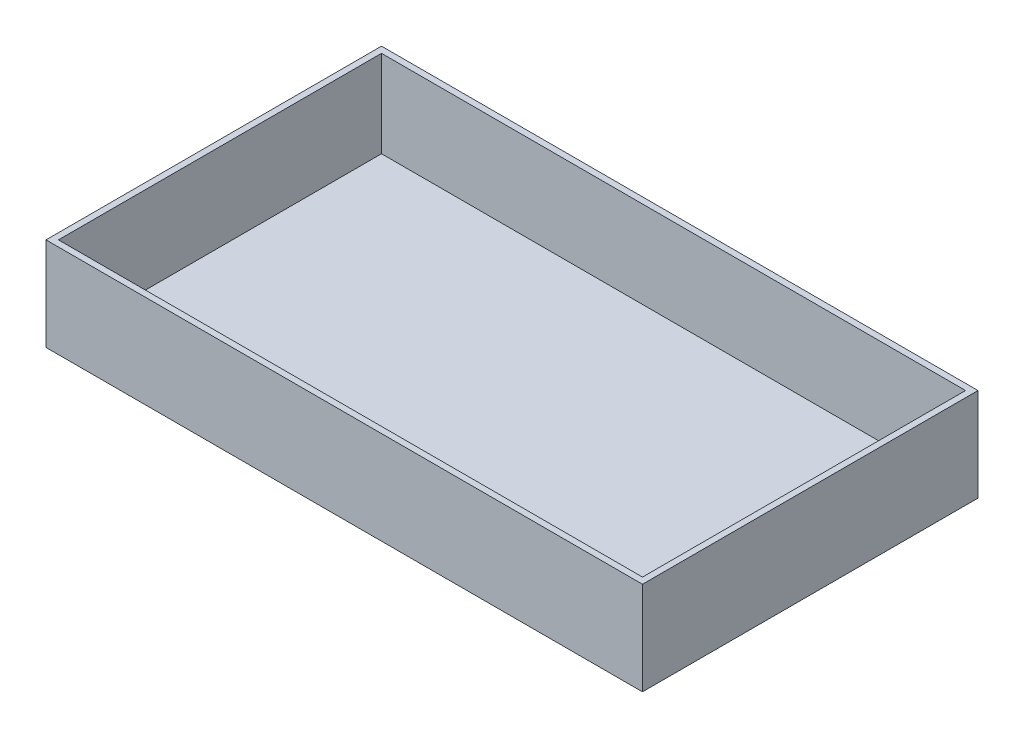
ISO-10303-21;
HEADER;
FILE_DESCRIPTION(('STEP AP214'),'2;1');
FILE_NAME('part.step','',(''),(''),'','','');
FILE_SCHEMA(('AUTOMOTIVE_DESIGN { 1 0 10303 214 1 1 1 1 }'));
ENDSEC;
DATA;
#1=APPLICATION_CONTEXT('core data for automotive mechanical design processes');
#2=APPLICATION_PROTOCOL_DEFINITION('international standard','automotive_design',2000,#1);
#3=PRODUCT_CONTEXT('',#1,'mechanical');
#4=PRODUCT('Part','Part','',(#3));
#5=PRODUCT_RELATED_PRODUCT_CATEGORY('part','',(#4));
#6=PRODUCT_DEFINITION_FORMATION('','',#4);
#7=PRODUCT_DEFINITION_CONTEXT('part definition',#1,'design');
#8=PRODUCT_DEFINITION('design','',#6,#7);
#9=PRODUCT_DEFINITION_SHAPE('','',#8);
#10=(LENGTH_UNIT() NAMED_UNIT(*) SI_UNIT(.MILLI.,.METRE.));
#11=(NAMED_UNIT(*) PLANE_ANGLE_UNIT() SI_UNIT($,.RADIAN.));
#12=(NAMED_UNIT(*) SI_UNIT($,.STERADIAN.) SOLID_ANGLE_UNIT());
#13=UNCERTAINTY_MEASURE_WITH_UNIT(LENGTH_MEASURE(1.E-05),#10,'distance_accuracy_value','');
#14=(GEOMETRIC_REPRESENTATION_CONTEXT(3) GLOBAL_UNCERTAINTY_ASSIGNED_CONTEXT((#13)) GLOBAL_UNIT_ASSIGNED_CONTEXT((#10,
#11,#12)) REPRESENTATION_CONTEXT('',''));
#15=CARTESIAN_POINT('',(0.,0.,0.));
#16=DIRECTION('',(0.,0.,1.));
#17=DIRECTION('',(1.,0.,0.));
#18=AXIS2_PLACEMENT_3D('',#15,#16,#17);
#19=CARTESIAN_POINT('',(240.,75.,-135.));
#20=DIRECTION('',(-1.,0.,0.));
#21=DIRECTION('',(0.,0.,1.));
#22=AXIS2_PLACEMENT_3D('',#19,#20,#21);
#23=PLANE('',#22);
#24=DIRECTION('',(0.,0.,-1.));
#25=VECTOR('',#24,1.);
#26=CARTESIAN_POINT('',(240.,0.,-135.));
#27=LINE('',#26,#25);
#28=CARTESIAN_POINT('',(240.,0.,135.));
#29=VERTEX_POINT('',#28);
#30=CARTESIAN_POINT('',(240.,0.,-135.));
#31=VERTEX_POINT('',#30);
#32=EDGE_CURVE('E167',#29,#31,#27,.T.);
#33=ORIENTED_EDGE('',*,*,#32,.T.);
#34=DIRECTION('',(0.,-1.,0.));
#35=VECTOR('',#34,1.);
#36=CARTESIAN_POINT('',(240.,75.,-135.));
#37=LINE('',#36,#35);
#38=CARTESIAN_POINT('',(240.,75.,-135.));
#39=VERTEX_POINT('',#38);
#40=EDGE_CURVE('E11',#39,#31,#37,.T.);
#41=ORIENTED_EDGE('',*,*,#40,.F.);
#42=DIRECTION('',(0.,0.,-1.));
#43=VECTOR('',#42,1.);
#44=CARTESIAN_POINT('',(240.,75.,-135.));
#45=LINE('',#44,#43);
#46=CARTESIAN_POINT('',(240.,75.,135.));
#47=VERTEX_POINT('',#46);
#48=EDGE_CURVE('E156',#47,#39,#45,.T.);
#49=ORIENTED_EDGE('',*,*,#48,.F.);
#50=DIRECTION('',(0.,-1.,0.));
#51=VECTOR('',#50,1.);
#52=CARTESIAN_POINT('',(240.,75.,135.));
#53=LINE('',#52,#51);
#54=EDGE_CURVE('E166',#47,#29,#53,.T.);
#55=ORIENTED_EDGE('',*,*,#54,.T.);
#56=EDGE_LOOP('',(#33,#41,#49,#55));
#57=FACE_BOUND('',#56,.T.);
#58=ADVANCED_FACE('F39',(#57),#23,.F.);
#59=CARTESIAN_POINT('',(-240.,75.,-135.));
#60=DIRECTION('',(0.,0.,1.));
#61=DIRECTION('',(1.,0.,0.));
#62=AXIS2_PLACEMENT_3D('',#59,#60,#61);
#63=PLANE('',#62);
#64=DIRECTION('',(-1.,0.,0.));
#65=VECTOR('',#64,1.);
#66=CARTESIAN_POINT('',(-240.,0.,-135.));
#67=LINE('',#66,#65);
#68=CARTESIAN_POINT('',(-240.,0.,-135.));
#69=VERTEX_POINT('',#68);
#70=EDGE_CURVE('E171',#31,#69,#67,.T.);
#71=ORIENTED_EDGE('',*,*,#70,.T.);
#72=DIRECTION('',(0.,-1.,0.));
#73=VECTOR('',#72,1.);
#74=CARTESIAN_POINT('',(-240.,75.,-135.));
#75=LINE('',#74,#73);
#76=CARTESIAN_POINT('',(-240.,75.,-135.));
#77=VERTEX_POINT('',#76);
#78=EDGE_CURVE('E47',#77,#69,#75,.T.);
#79=ORIENTED_EDGE('',*,*,#78,.F.);
#80=DIRECTION('',(-1.,0.,0.));
#81=VECTOR('',#80,1.);
#82=CARTESIAN_POINT('',(-240.,75.,-135.));
#83=LINE('',#82,#81);
#84=EDGE_CURVE('E91',#39,#77,#83,.T.);
#85=ORIENTED_EDGE('',*,*,#84,.F.);
#86=ORIENTED_EDGE('',*,*,#40,.T.);
#87=EDGE_LOOP('',(#71,#79,#85,#86));
#88=FACE_BOUND('',#87,.T.);
#89=ADVANCED_FACE('F206',(#88),#63,.F.);
#90=CARTESIAN_POINT('',(-240.,75.,-135.));
#91=DIRECTION('',(1.,0.,0.));
#92=DIRECTION('',(0.,0.,-1.));
#93=AXIS2_PLACEMENT_3D('',#90,#91,#92);
#94=PLANE('',#93);
#95=DIRECTION('',(0.,0.,1.));
#96=VECTOR('',#95,1.);
#97=CARTESIAN_POINT('',(-240.,0.,-135.));
#98=LINE('',#97,#96);
#99=CARTESIAN_POINT('',(-240.,0.,135.));
#100=VERTEX_POINT('',#99);
#101=EDGE_CURVE('E174',#69,#100,#98,.T.);
#102=ORIENTED_EDGE('',*,*,#101,.T.);
#103=DIRECTION('',(0.,-1.,0.));
#104=VECTOR('',#103,1.);
#105=CARTESIAN_POINT('',(-240.,75.,135.));
#106=LINE('',#105,#104);
#107=CARTESIAN_POINT('',(-240.,75.,135.));
#108=VERTEX_POINT('',#107);
#109=EDGE_CURVE('E181',#108,#100,#106,.T.);
#110=ORIENTED_EDGE('',*,*,#109,.F.);
#111=DIRECTION('',(0.,0.,1.));
#112=VECTOR('',#111,1.);
#113=CARTESIAN_POINT('',(-240.,75.,-135.));
#114=LINE('',#113,#112);
#115=EDGE_CURVE('E161',#77,#108,#114,.T.);
#116=ORIENTED_EDGE('',*,*,#115,.F.);
#117=ORIENTED_EDGE('',*,*,#78,.T.);
#118=EDGE_LOOP('',(#102,#110,#116,#117));
#119=FACE_BOUND('',#118,.T.);
#120=ADVANCED_FACE('F188',(#119),#94,.F.);
#121=CARTESIAN_POINT('',(-240.,75.,135.));
#122=DIRECTION('',(0.,0.,-1.));
#123=DIRECTION('',(-1.,0.,0.));
#124=AXIS2_PLACEMENT_3D('',#121,#122,#123);
#125=PLANE('',#124);
#126=DIRECTION('',(1.,0.,0.));
#127=VECTOR('',#126,1.);
#128=CARTESIAN_POINT('',(-240.,0.,135.));
#129=LINE('',#128,#127);
#130=EDGE_CURVE('E84',#100,#29,#129,.T.);
#131=ORIENTED_EDGE('',*,*,#130,.T.);
#132=ORIENTED_EDGE('',*,*,#54,.F.);
#133=DIRECTION('',(1.,0.,0.));
#134=VECTOR('',#133,1.);
#135=CARTESIAN_POINT('',(-240.,75.,135.));
#136=LINE('',#135,#134);
#137=EDGE_CURVE('E63',#108,#47,#136,.T.);
#138=ORIENTED_EDGE('',*,*,#137,.F.);
#139=ORIENTED_EDGE('',*,*,#109,.T.);
#140=EDGE_LOOP('',(#131,#132,#138,#139));
#141=FACE_BOUND('',#140,.T.);
#142=ADVANCED_FACE('F196',(#141),#125,.F.);
#143=CARTESIAN_POINT('',(0.,75.,0.));
#144=DIRECTION('',(0.,1.,0.));
#145=DIRECTION('',(0.,0.,1.));
#146=AXIS2_PLACEMENT_3D('',#143,#144,#145);
#147=PLANE('',#146);
#148=DIRECTION('',(0.,0.,-1.));
#149=VECTOR('',#148,1.);
#150=CARTESIAN_POINT('',(235.,75.,-135.));
#151=LINE('',#150,#149);
#152=CARTESIAN_POINT('',(235.,75.,130.));
#153=VERTEX_POINT('',#152);
#154=CARTESIAN_POINT('',(235.,75.,-130.));
#155=VERTEX_POINT('',#154);
#156=EDGE_CURVE('E140',#153,#155,#151,.T.);
#157=ORIENTED_EDGE('',*,*,#156,.F.);
#158=DIRECTION('',(1.,0.,0.));
#159=VECTOR('',#158,1.);
#160=CARTESIAN_POINT('',(-240.,75.,130.));
#161=LINE('',#160,#159);
#162=CARTESIAN_POINT('',(-235.,75.,130.));
#163=VERTEX_POINT('',#162);
#164=EDGE_CURVE('E153',#163,#153,#161,.T.);
#165=ORIENTED_EDGE('',*,*,#164,.F.);
#166=DIRECTION('',(0.,0.,1.));
#167=VECTOR('',#166,1.);
#168=CARTESIAN_POINT('',(-235.,75.,-135.));
#169=LINE('',#168,#167);
#170=CARTESIAN_POINT('',(-235.,75.,-130.));
#171=VERTEX_POINT('',#170);
#172=EDGE_CURVE('E150',#171,#163,#169,.T.);
#173=ORIENTED_EDGE('',*,*,#172,.F.);
#174=DIRECTION('',(-1.,0.,0.));
#175=VECTOR('',#174,1.);
#176=CARTESIAN_POINT('',(-240.,75.,-130.));
#177=LINE('',#176,#175);
#178=EDGE_CURVE('E129',#155,#171,#177,.T.);
#179=ORIENTED_EDGE('',*,*,#178,.F.);
#180=EDGE_LOOP('',(#157,#165,#173,#179));
#181=FACE_BOUND('',#180,.T.);
#182=ORIENTED_EDGE('',*,*,#48,.T.);
#183=ORIENTED_EDGE('',*,*,#84,.T.);
#184=ORIENTED_EDGE('',*,*,#115,.T.);
#185=ORIENTED_EDGE('',*,*,#137,.T.);
#186=EDGE_LOOP('',(#182,#183,#184,#185));
#187=FACE_BOUND('',#186,.T.);
#188=ADVANCED_FACE('F198',(#181,#187),#147,.T.);
#189=CARTESIAN_POINT('',(0.,0.,0.));
#190=DIRECTION('',(0.,1.,0.));
#191=DIRECTION('',(0.,0.,1.));
#192=AXIS2_PLACEMENT_3D('',#189,#190,#191);
#193=PLANE('',#192);
#194=ORIENTED_EDGE('',*,*,#32,.F.);
#195=ORIENTED_EDGE('',*,*,#130,.F.);
#196=ORIENTED_EDGE('',*,*,#101,.F.);
#197=ORIENTED_EDGE('',*,*,#70,.F.);
#198=EDGE_LOOP('',(#194,#195,#196,#197));
#199=FACE_BOUND('',#198,.T.);
#200=ADVANCED_FACE('F192',(#199),#193,.F.);
#201=CARTESIAN_POINT('',(235.,75.,-135.));
#202=DIRECTION('',(-1.,0.,0.));
#203=DIRECTION('',(0.,0.,1.));
#204=AXIS2_PLACEMENT_3D('',#201,#202,#203);
#205=PLANE('',#204);
#206=DIRECTION('',(0.,0.,-1.));
#207=VECTOR('',#206,1.);
#208=CARTESIAN_POINT('',(235.,5.,-135.));
#209=LINE('',#208,#207);
#210=CARTESIAN_POINT('',(235.,5.,130.));
#211=VERTEX_POINT('',#210);
#212=CARTESIAN_POINT('',(235.,5.,-130.));
#213=VERTEX_POINT('',#212);
#214=EDGE_CURVE('E119',#211,#213,#209,.T.);
#215=ORIENTED_EDGE('',*,*,#214,.F.);
#216=DIRECTION('',(0.,-1.,0.));
#217=VECTOR('',#216,1.);
#218=CARTESIAN_POINT('',(235.,75.,130.));
#219=LINE('',#218,#217);
#220=EDGE_CURVE('E144',#153,#211,#219,.T.);
#221=ORIENTED_EDGE('',*,*,#220,.F.);
#222=ORIENTED_EDGE('',*,*,#156,.T.);
#223=DIRECTION('',(0.,-1.,0.));
#224=VECTOR('',#223,1.);
#225=CARTESIAN_POINT('',(235.,75.,-130.));
#226=LINE('',#225,#224);
#227=EDGE_CURVE('E133',#155,#213,#226,.T.);
#228=ORIENTED_EDGE('',*,*,#227,.T.);
#229=EDGE_LOOP('',(#215,#221,#222,#228));
#230=FACE_BOUND('',#229,.T.);
#231=ADVANCED_FACE('F233',(#230),#205,.T.);
#232=CARTESIAN_POINT('',(-240.,75.,-130.));
#233=DIRECTION('',(0.,0.,1.));
#234=DIRECTION('',(1.,0.,0.));
#235=AXIS2_PLACEMENT_3D('',#232,#233,#234);
#236=PLANE('',#235);
#237=DIRECTION('',(-1.,0.,0.));
#238=VECTOR('',#237,1.);
#239=CARTESIAN_POINT('',(-240.,5.,-130.));
#240=LINE('',#239,#238);
#241=CARTESIAN_POINT('',(-235.,5.,-130.));
#242=VERTEX_POINT('',#241);
#243=EDGE_CURVE('E113',#213,#242,#240,.T.);
#244=ORIENTED_EDGE('',*,*,#243,.F.);
#245=ORIENTED_EDGE('',*,*,#227,.F.);
#246=ORIENTED_EDGE('',*,*,#178,.T.);
#247=DIRECTION('',(0.,-1.,0.));
#248=VECTOR('',#247,1.);
#249=CARTESIAN_POINT('',(-235.,75.,-130.));
#250=LINE('',#249,#248);
#251=EDGE_CURVE('E126',#171,#242,#250,.T.);
#252=ORIENTED_EDGE('',*,*,#251,.T.);
#253=EDGE_LOOP('',(#244,#245,#246,#252));
#254=FACE_BOUND('',#253,.T.);
#255=ADVANCED_FACE('F127',(#254),#236,.T.);
#256=CARTESIAN_POINT('',(-235.,75.,-135.));
#257=DIRECTION('',(1.,0.,0.));
#258=DIRECTION('',(0.,0.,-1.));
#259=AXIS2_PLACEMENT_3D('',#256,#257,#258);
#260=PLANE('',#259);
#261=DIRECTION('',(0.,0.,1.));
#262=VECTOR('',#261,1.);
#263=CARTESIAN_POINT('',(-235.,5.,-135.));
#264=LINE('',#263,#262);
#265=CARTESIAN_POINT('',(-235.,5.,130.));
#266=VERTEX_POINT('',#265);
#267=EDGE_CURVE('E117',#242,#266,#264,.T.);
#268=ORIENTED_EDGE('',*,*,#267,.F.);
#269=ORIENTED_EDGE('',*,*,#251,.F.);
#270=ORIENTED_EDGE('',*,*,#172,.T.);
#271=DIRECTION('',(0.,-1.,0.));
#272=VECTOR('',#271,1.);
#273=CARTESIAN_POINT('',(-235.,75.,130.));
#274=LINE('',#273,#272);
#275=EDGE_CURVE('E54',#163,#266,#274,.T.);
#276=ORIENTED_EDGE('',*,*,#275,.T.);
#277=EDGE_LOOP('',(#268,#269,#270,#276));
#278=FACE_BOUND('',#277,.T.);
#279=ADVANCED_FACE('F135',(#278),#260,.T.);
#280=CARTESIAN_POINT('',(-240.,75.,130.));
#281=DIRECTION('',(0.,0.,-1.));
#282=DIRECTION('',(-1.,0.,0.));
#283=AXIS2_PLACEMENT_3D('',#280,#281,#282);
#284=PLANE('',#283);
#285=DIRECTION('',(1.,0.,0.));
#286=VECTOR('',#285,1.);
#287=CARTESIAN_POINT('',(-240.,5.,130.));
#288=LINE('',#287,#286);
#289=EDGE_CURVE('E137',#266,#211,#288,.T.);
#290=ORIENTED_EDGE('',*,*,#289,.F.);
#291=ORIENTED_EDGE('',*,*,#275,.F.);
#292=ORIENTED_EDGE('',*,*,#164,.T.);
#293=ORIENTED_EDGE('',*,*,#220,.T.);
#294=EDGE_LOOP('',(#290,#291,#292,#293));
#295=FACE_BOUND('',#294,.T.);
#296=ADVANCED_FACE('F263',(#295),#284,.T.);
#297=CARTESIAN_POINT('',(0.,5.,0.));
#298=DIRECTION('',(0.,1.,0.));
#299=DIRECTION('',(0.,0.,1.));
#300=AXIS2_PLACEMENT_3D('',#297,#298,#299);
#301=PLANE('',#300);
#302=ORIENTED_EDGE('',*,*,#214,.T.);
#303=ORIENTED_EDGE('',*,*,#243,.T.);
#304=ORIENTED_EDGE('',*,*,#267,.T.);
#305=ORIENTED_EDGE('',*,*,#289,.T.);
#306=EDGE_LOOP('',(#302,#303,#304,#305));
#307=FACE_BOUND('',#306,.T.);
#308=ADVANCED_FACE('F115',(#307),#301,.T.);
#309=CLOSED_SHELL('',(#58,#89,#120,#142,#188,#200,#231,#255,#279,#296,#308));
#310=MANIFOLD_SOLID_BREP('B2',#309);
#311=ADVANCED_BREP_SHAPE_REPRESENTATION('',(#18,#310),#14);
#312=SHAPE_DEFINITION_REPRESENTATION(#9,#311);
ENDSEC;
END-ISO-10303-21;
